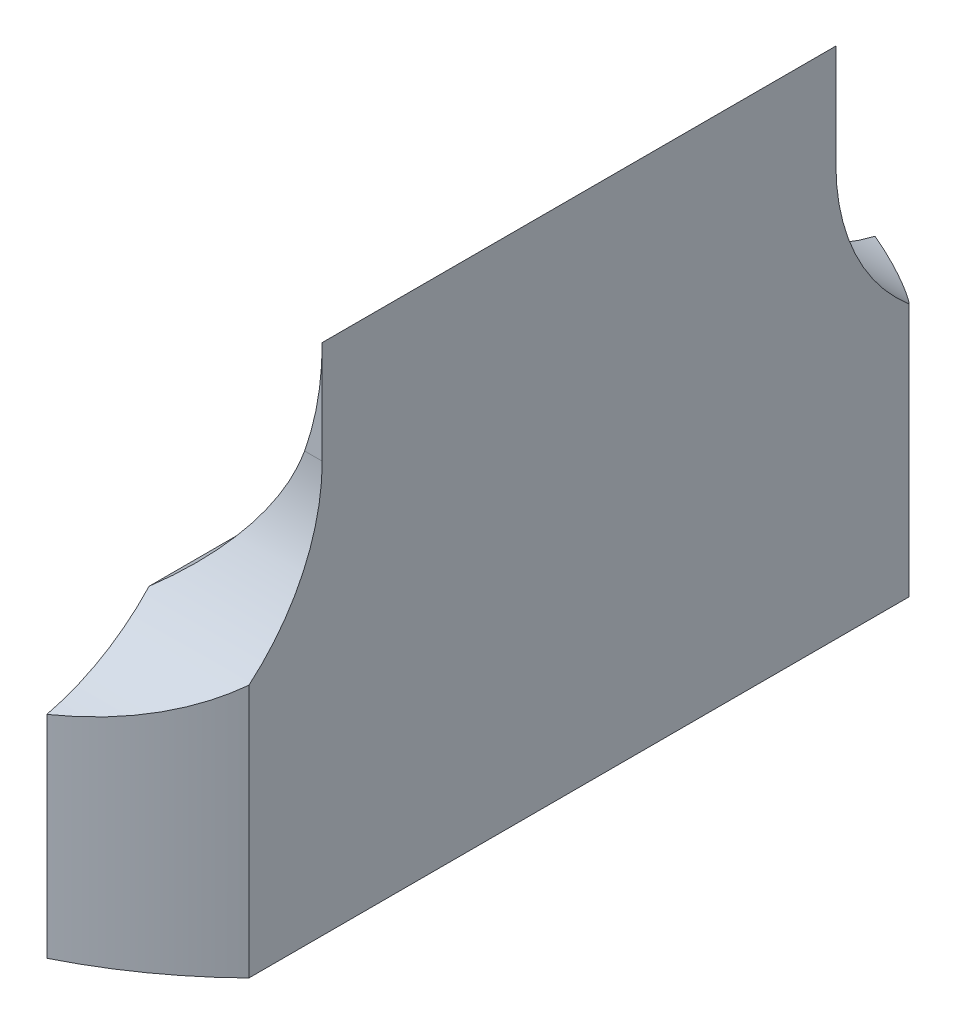
ISO-10303-21;
HEADER;
FILE_DESCRIPTION(('STEP AP214'),'2;1');
FILE_NAME('part.step','',(''),(''),'','','');
FILE_SCHEMA(('AUTOMOTIVE_DESIGN { 1 0 10303 214 1 1 1 1 }'));
ENDSEC;
DATA;
#1=APPLICATION_CONTEXT('core data for automotive mechanical design processes');
#2=APPLICATION_PROTOCOL_DEFINITION('international standard','automotive_design',2000,#1);
#3=PRODUCT_CONTEXT('',#1,'mechanical');
#4=PRODUCT('Part','Part','',(#3));
#5=PRODUCT_RELATED_PRODUCT_CATEGORY('part','',(#4));
#6=PRODUCT_DEFINITION_FORMATION('','',#4);
#7=PRODUCT_DEFINITION_CONTEXT('part definition',#1,'design');
#8=PRODUCT_DEFINITION('design','',#6,#7);
#9=PRODUCT_DEFINITION_SHAPE('','',#8);
#10=(LENGTH_UNIT() NAMED_UNIT(*) SI_UNIT(.MILLI.,.METRE.));
#11=(NAMED_UNIT(*) PLANE_ANGLE_UNIT() SI_UNIT($,.RADIAN.));
#12=(NAMED_UNIT(*) SI_UNIT($,.STERADIAN.) SOLID_ANGLE_UNIT());
#13=UNCERTAINTY_MEASURE_WITH_UNIT(LENGTH_MEASURE(1.E-05),#10,'distance_accuracy_value','');
#14=(GEOMETRIC_REPRESENTATION_CONTEXT(3) GLOBAL_UNCERTAINTY_ASSIGNED_CONTEXT((#13)) GLOBAL_UNIT_ASSIGNED_CONTEXT((#10,
#11,#12)) REPRESENTATION_CONTEXT('',''));
#15=CARTESIAN_POINT('',(0.,0.,0.));
#16=DIRECTION('',(0.,0.,1.));
#17=DIRECTION('',(1.,0.,0.));
#18=AXIS2_PLACEMENT_3D('',#15,#16,#17);
#19=CARTESIAN_POINT('',(0.,0.,0.));
#20=DIRECTION('',(0.,1.,0.));
#21=DIRECTION('',(1.,0.,0.));
#22=AXIS2_PLACEMENT_3D('',#19,#20,#21);
#23=CYLINDRICAL_SURFACE('',#22,28.575);
#24=CARTESIAN_POINT('',(0.,0.,0.));
#25=DIRECTION('',(0.,1.,0.));
#26=DIRECTION('',(1.,0.,0.));
#27=AXIS2_PLACEMENT_3D('',#24,#25,#26);
#28=CIRCLE('',#27,28.575);
#29=CARTESIAN_POINT('',(20.0025,0.,-20.4066317345612));
#30=VERTEX_POINT('',#29);
#31=CARTESIAN_POINT('',(12.7,0.,-25.5976683508479));
#32=VERTEX_POINT('',#31);
#33=EDGE_CURVE('E306',#30,#32,#28,.T.);
#34=ORIENTED_EDGE('',*,*,#33,.T.);
#35=DIRECTION('',(0.,1.,0.));
#36=VECTOR('',#35,1.);
#37=CARTESIAN_POINT('',(12.7,0.,-25.5976683508479));
#38=LINE('',#37,#36);
#39=CARTESIAN_POINT('',(12.7,13.0539279019213,-25.5976683508479));
#40=VERTEX_POINT('',#39);
#41=EDGE_CURVE('E336',#32,#40,#38,.T.);
#42=ORIENTED_EDGE('',*,*,#41,.T.);
#43=CARTESIAN_POINT('',(0.962642902416936,12.7000103571768,-28.5587804999168));
#44=CARTESIAN_POINT('',(1.36077615031565,12.7000623405133,-28.545365693838));
#45=CARTESIAN_POINT('',(1.75862825689667,12.7000777129765,-28.5236151588989));
#46=CARTESIAN_POINT('',(2.55307899624457,12.7004445435241,-28.4635033904875));
#47=CARTESIAN_POINT('',(2.94967761793325,12.7007960045706,-28.4251420106213));
#48=CARTESIAN_POINT('',(3.74118366922109,12.7022448100237,-28.3318388404815));
#49=CARTESIAN_POINT('',(4.13608981320989,12.7033426454376,-28.2768861487437));
#50=CARTESIAN_POINT('',(4.92324947448467,12.7069381444454,-28.1505085427578));
#51=CARTESIAN_POINT('',(5.31550300582789,12.7094358006152,-28.0790837158725));
#52=CARTESIAN_POINT('',(6.09971504117371,12.7166858056302,-27.9192672118512));
#53=CARTESIAN_POINT('',(6.49164726348036,12.7214556290705,-27.8307472529637));
#54=CARTESIAN_POINT('',(7.27137941731256,12.7342954372856,-27.6372759368325));
#55=CARTESIAN_POINT('',(7.65917937419231,12.7423654017998,-27.5323246804678));
#56=CARTESIAN_POINT('',(8.42975640726492,12.7630247664457,-27.3062442784199));
#57=CARTESIAN_POINT('',(8.812535403216,12.7756123837616,-27.1851215263703));
#58=CARTESIAN_POINT('',(9.57240196748498,12.8067151018847,-26.9269527073114));
#59=CARTESIAN_POINT('',(9.94948990980164,12.8252298113896,-26.7899076918588));
#60=CARTESIAN_POINT('',(10.8728927575956,12.8802289715004,-26.4321390525976));
#61=CARTESIAN_POINT('',(11.4154826552702,12.9210691871274,-26.2023507001268));
#62=CARTESIAN_POINT('',(12.4837500266805,13.0247001334094,-25.7105492113056));
#63=CARTESIAN_POINT('',(13.0094275044118,13.0874908588784,-25.4485360825686));
#64=CARTESIAN_POINT('',(14.0386470858148,13.2413188734462,-24.8955218171325));
#65=CARTESIAN_POINT('',(14.5422624206026,13.3322531031995,-24.6046290332762));
#66=CARTESIAN_POINT('',(15.5253033019172,13.5496409172664,-23.9964408297565));
#67=CARTESIAN_POINT('',(16.00473774698,13.6760813211813,-23.6791552381808));
#68=CARTESIAN_POINT('',(16.8002547898732,13.929279583978,-23.1180863962697));
#69=CARTESIAN_POINT('',(17.1234791710534,14.0453697562309,-22.8795842100204));
#70=CARTESIAN_POINT('',(17.7534814131775,14.3020869366,-22.3942506229836));
#71=CARTESIAN_POINT('',(18.0602635161153,14.4427075758031,-22.1474213975529));
#72=CARTESIAN_POINT('',(18.6552298763283,14.7509891906541,-21.6486405827816));
#73=CARTESIAN_POINT('',(18.9434257661075,14.918633018846,-21.3966923297231));
#74=CARTESIAN_POINT('',(19.4993082019271,15.2832535267728,-20.8913521403136));
#75=CARTESIAN_POINT('',(19.7669984548326,15.4802248858411,-20.637960473833));
#76=CARTESIAN_POINT('',(20.2341271799045,15.8672649269116,-20.1791498359493));
#77=CARTESIAN_POINT('',(20.4372307457066,16.0523162460672,-19.9732236603793));
#78=CARTESIAN_POINT('',(20.8271119032842,16.443796771241,-19.566332808773));
#79=CARTESIAN_POINT('',(21.0138928922247,16.6502215092449,-19.3653671066071));
#80=CARTESIAN_POINT('',(21.3701713388706,17.0844581862898,-18.9714767807781));
#81=CARTESIAN_POINT('',(21.5396731298472,17.3122647355465,-18.7785501482909));
#82=CARTESIAN_POINT('',(21.8606787693203,17.7888329761935,-18.4038644456906));
#83=CARTESIAN_POINT('',(22.0121823832151,18.0375949406601,-18.2221055211605));
#84=CARTESIAN_POINT('',(22.297438272533,18.5565357054162,-17.8719385766029));
#85=CARTESIAN_POINT('',(22.43108358143,18.8268293204708,-17.7036132443653));
#86=CARTESIAN_POINT('',(22.6792372793659,19.3860036069198,-17.3845820904179));
#87=CARTESIAN_POINT('',(22.7937450745925,19.6748848546794,-17.2338768154791));
#88=CARTESIAN_POINT('',(23.0034597025063,20.269136197845,-16.9529413254649));
#89=CARTESIAN_POINT('',(23.0986674148259,20.574505540976,-16.822710177309));
#90=CARTESIAN_POINT('',(23.2697906025738,21.1992400080802,-16.5852020755217));
#91=CARTESIAN_POINT('',(23.3457083796063,21.518603456992,-16.4779223836487));
#92=CARTESIAN_POINT('',(23.4701116509596,22.1280288861558,-16.3001450750981));
#93=CARTESIAN_POINT('',(23.5208356823792,22.4167889071979,-16.2267309964662));
#94=CARTESIAN_POINT('',(23.6076984467501,23.0008228741884,-16.1000964209253));
#95=CARTESIAN_POINT('',(23.6438389597366,23.2960960205151,-16.0468734595763));
#96=CARTESIAN_POINT('',(23.7016972571996,23.8916759999176,-15.9612926924391));
#97=CARTESIAN_POINT('',(23.7233869802776,24.1919914724441,-15.9289754861961));
#98=CARTESIAN_POINT('',(23.7450719580057,24.6440955559499,-15.8966136680499));
#99=CARTESIAN_POINT('',(23.7504920138014,24.795104240061,-15.8885120518663));
#100=CARTESIAN_POINT('',(23.7577175691597,25.0974022819727,-15.8777046291041));
#101=CARTESIAN_POINT('',(23.7595230358034,25.2486916423168,-15.874998871667));
#102=CARTESIAN_POINT('',(23.7595244060145,25.39999999873,-15.875));
#103=B_SPLINE_CURVE_WITH_KNOTS('',3,(#43,#44,#45,#46,#47,#48,#49,#50,#51,#52,#53,#54,#55,#56,
#57,#58,#59,#60,#61,#62,#63,#64,#65,#66,#67,#68,#69,#70,#71,#72,#73,#74,#75,#76,#77,#78,#79,#80,
#81,#82,#83,#84,#85,#86,#87,#88,#89,#90,#91,#92,#93,#94,#95,#96,#97,#98,#99,#100,#101,#102),
.UNSPECIFIED.,.F.,.F.,(4,2,2,2,2,2,2,2,2,2,2,2,2,2,2,2,2,2,2,2,2,2,2,2,2,2,2,2,2,4),(0.,
1.19499017100449,2.38999087385894,3.58577847732212,4.78155973885813,5.98668965465626,
7.19181217191521,8.3964596298037,9.60102757414392,11.3715014481902,13.1419749039502,
14.9060402358483,16.6694515852073,17.9228644913696,19.1759524534986,20.4282483813539,
21.6803173910788,22.7094151795703,23.738298272616,24.7669227046618,25.7955605430864,
26.8301070987827,27.8646857491597,28.8992172363417,29.9336252290081,30.8392539837282,
31.7447721657534,32.6520436509738,33.1058917453607,33.559743973042),.UNSPECIFIED.);
#104=CARTESIAN_POINT('',(20.0025,15.6754043847483,-20.4066317345612));
#105=VERTEX_POINT('',#104);
#106=EDGE_CURVE('E54',#40,#105,#103,.T.);
#107=ORIENTED_EDGE('',*,*,#106,.T.);
#108=DIRECTION('',(0.,1.,0.));
#109=VECTOR('',#108,1.);
#110=CARTESIAN_POINT('',(20.0025,0.,-20.4066317345612));
#111=LINE('',#110,#109);
#112=EDGE_CURVE('E334',#105,#30,#111,.F.);
#113=ORIENTED_EDGE('',*,*,#112,.T.);
#114=EDGE_LOOP('',(#34,#42,#107,#113));
#115=FACE_BOUND('',#114,.T.);
#116=ADVANCED_FACE('F49',(#115),#23,.T.);
#117=CARTESIAN_POINT('',(0.962642902407336,12.7000103571768,28.5587804999171));
#118=CARTESIAN_POINT('',(1.36077615030607,12.7000623405133,28.5453656938385));
#119=CARTESIAN_POINT('',(1.75862825688711,12.7000777129765,28.5236151588994));
#120=CARTESIAN_POINT('',(2.55307899623505,12.7004445435241,28.4635033904883));
#121=CARTESIAN_POINT('',(2.94967761792375,12.7007960045706,28.4251420106223));
#122=CARTESIAN_POINT('',(3.74118366921165,12.7022448100237,28.3318388404827));
#123=CARTESIAN_POINT('',(4.13608981320048,12.7033426454376,28.2768861487451));
#124=CARTESIAN_POINT('',(4.92324947447532,12.7069381444453,28.1505085427594));
#125=CARTESIAN_POINT('',(5.31550300581858,12.7094358006151,28.0790837158743));
#126=CARTESIAN_POINT('',(6.09971504116446,12.7166858056301,27.9192672118532));
#127=CARTESIAN_POINT('',(6.49164726347116,12.7214556290704,27.8307472529658));
#128=CARTESIAN_POINT('',(7.27137941730344,12.7342954372854,27.6372759368349));
#129=CARTESIAN_POINT('',(7.65917937418324,12.7423654017996,27.5323246804704));
#130=CARTESIAN_POINT('',(8.42975640725595,12.7630247664454,27.3062442784227));
#131=CARTESIAN_POINT('',(8.81253540320708,12.7756123837612,27.1851215263732));
#132=CARTESIAN_POINT('',(9.57240196747617,12.8067151018843,26.9269527073146));
#133=CARTESIAN_POINT('',(9.94948990979289,12.8252298113892,26.789907691862));
#134=CARTESIAN_POINT('',(10.8728927575873,12.8802289714998,26.4321390526011));
#135=CARTESIAN_POINT('',(11.4154826552622,12.9210691871268,26.2023507001303));
#136=CARTESIAN_POINT('',(12.4837500266732,13.0247001334086,25.7105492113091));
#137=CARTESIAN_POINT('',(13.0094275044049,13.0874908588775,25.4485360825722));
#138=CARTESIAN_POINT('',(14.0386470858086,13.2413188734451,24.895521817136));
#139=CARTESIAN_POINT('',(14.5422624205967,13.3322531031984,24.6046290332797));
#140=CARTESIAN_POINT('',(15.525303301912,13.5496409172651,23.9964408297599));
#141=CARTESIAN_POINT('',(16.0047377469751,13.6760813211799,23.6791552381842));
#142=CARTESIAN_POINT('',(16.8002547898687,13.9292795839765,23.1180863962729));
#143=CARTESIAN_POINT('',(17.1234791710491,14.0453697562292,22.8795842100236));
#144=CARTESIAN_POINT('',(17.7534814131735,14.3020869365982,22.3942506229869));
#145=CARTESIAN_POINT('',(18.0602635161113,14.4427075758013,22.1474213975561));
#146=CARTESIAN_POINT('',(18.6552298763247,14.750989190652,21.6486405827847));
#147=CARTESIAN_POINT('',(18.943425766104,14.9186330188439,21.3966923297261));
#148=CARTESIAN_POINT('',(19.499308201924,15.2832535267705,20.8913521403166));
#149=CARTESIAN_POINT('',(19.7669984548296,15.4802248858388,20.6379604738359));
#150=CARTESIAN_POINT('',(20.2341271799018,15.8672649269092,20.1791498359521));
#151=CARTESIAN_POINT('',(20.437230745704,16.0523162460648,19.973223660382));
#152=CARTESIAN_POINT('',(20.8271119032818,16.4437967712384,19.5663328087756));
#153=CARTESIAN_POINT('',(21.0138928922225,16.6502215092423,19.3653671066095));
#154=CARTESIAN_POINT('',(21.3701713388686,17.0844581862872,18.9714767807804));
#155=CARTESIAN_POINT('',(21.5396731298453,17.3122647355437,18.7785501482932));
#156=CARTESIAN_POINT('',(21.8606787693184,17.7888329761907,18.4038644456928));
#157=CARTESIAN_POINT('',(22.0121823832134,18.0375949406571,18.2221055211626));
#158=CARTESIAN_POINT('',(22.2974382725314,18.556535705413,17.8719385766049));
#159=CARTESIAN_POINT('',(22.4310835814285,18.8268293204675,17.7036132443673));
#160=CARTESIAN_POINT('',(22.6792372793645,19.3860036069163,17.3845820904198));
#161=CARTESIAN_POINT('',(22.7937450745911,19.6748848546757,17.233876815481));
#162=CARTESIAN_POINT('',(23.0034597025051,20.2691361978413,16.9529413254666));
#163=CARTESIAN_POINT('',(23.0986674148248,20.5745055409723,16.8227101773105));
#164=CARTESIAN_POINT('',(23.269790602573,21.1992400080767,16.5852020755229));
#165=CARTESIAN_POINT('',(23.3457083796055,21.5186034569886,16.4779223836498));
#166=CARTESIAN_POINT('',(23.4701116509792,22.1280288862518,16.3001450750701));
#167=CARTESIAN_POINT('',(23.520835682414,22.4167889073961,16.2267309964158));
#168=CARTESIAN_POINT('',(23.6076984468052,23.000822874595,16.1000964208445));
#169=CARTESIAN_POINT('',(23.6438389597967,23.2960960210277,16.0468734594876));
#170=CARTESIAN_POINT('',(23.7016972572599,23.8916760006455,15.9612926923495));
#171=CARTESIAN_POINT('',(23.723386980333,24.1919914732812,15.9289754861136));
#172=CARTESIAN_POINT('',(23.7450719580461,24.6440955569502,15.8966136679896));
#173=CARTESIAN_POINT('',(23.7504920138354,24.7951042411157,15.8885120518154));
#174=CARTESIAN_POINT('',(23.7577175691787,25.0974022831355,15.8777046290757));
#175=CARTESIAN_POINT('',(23.7595230358135,25.2486916435334,15.8749988716518));
#176=CARTESIAN_POINT('',(23.7595244060145,25.4,15.875));
#177=B_SPLINE_CURVE_WITH_KNOTS('',3,(#117,#118,#119,#120,#121,#122,#123,#124,#125,#126,#127,
#128,#129,#130,#131,#132,#133,#134,#135,#136,#137,#138,#139,#140,#141,#142,#143,#144,#145,#146,
#147,#148,#149,#150,#151,#152,#153,#154,#155,#156,#157,#158,#159,#160,#161,#162,#163,#164,#165,
#166,#167,#168,#169,#170,#171,#172,#173,#174,#175,#176),.UNSPECIFIED.,.F.,.F.,(4,2,2,2,2,2,2,2,
2,2,2,2,2,2,2,2,2,2,2,2,2,2,2,2,2,2,2,2,2,4),(0.,1.19499017100453,2.38999087385901,
3.58577847732223,4.78155973885826,5.98668965465643,7.19181217191541,8.39645962980394,
9.60102757414419,11.3715014481914,13.1419749039523,14.9060402358512,16.6694515852111,
17.9228644913736,19.1759524535028,20.4282483813585,21.6803173910837,22.7094151795755,
23.7382982726215,24.7669227046673,25.795560543092,26.8301070987882,27.8646857491649,
28.8992172363473,29.9336252290144,30.8392539840501,31.7447721663913,32.652043651932,
33.1058917464792,33.5597439743207),.UNSPECIFIED.);
#178=CARTESIAN_POINT('',(12.7,13.0539279019213,25.5976683508479));
#179=VERTEX_POINT('',#178);
#180=CARTESIAN_POINT('',(20.0025,15.6754043847483,20.4066317345612));
#181=VERTEX_POINT('',#180);
#182=EDGE_CURVE('E364',#179,#181,#177,.T.);
#183=ORIENTED_EDGE('',*,*,#182,.F.);
#184=DIRECTION('',(0.,1.,0.));
#185=VECTOR('',#184,1.);
#186=CARTESIAN_POINT('',(12.7,0.,25.5976683508479));
#187=LINE('',#186,#185);
#188=CARTESIAN_POINT('',(12.7,0.,25.5976683508479));
#189=VERTEX_POINT('',#188);
#190=EDGE_CURVE('E130',#179,#189,#187,.F.);
#191=ORIENTED_EDGE('',*,*,#190,.T.);
#192=CARTESIAN_POINT('',(20.0025,0.,20.4066317345612));
#193=VERTEX_POINT('',#192);
#194=EDGE_CURVE('E302',#189,#193,#28,.T.);
#195=ORIENTED_EDGE('',*,*,#194,.T.);
#196=DIRECTION('',(0.,1.,0.));
#197=VECTOR('',#196,1.);
#198=CARTESIAN_POINT('',(20.0025,0.,20.4066317345612));
#199=LINE('',#198,#197);
#200=EDGE_CURVE('E344',#193,#181,#199,.T.);
#201=ORIENTED_EDGE('',*,*,#200,.T.);
#202=EDGE_LOOP('',(#183,#191,#195,#201));
#203=FACE_BOUND('',#202,.T.);
#204=ADVANCED_FACE('F193',(#203),#23,.T.);
#205=CARTESIAN_POINT('',(-31.75,25.4,-28.575));
#206=DIRECTION('',(-1.,0.,0.));
#207=DIRECTION('',(0.,0.,1.));
#208=AXIS2_PLACEMENT_3D('',#205,#206,#207);
#209=CYLINDRICAL_SURFACE('',#208,12.7);
#210=CARTESIAN_POINT('',(12.7,25.4,-28.575));
#211=DIRECTION('',(-1.,0.,0.));
#212=DIRECTION('',(0.,0.,1.));
#213=AXIS2_PLACEMENT_3D('',#210,#211,#212);
#214=CIRCLE('',#213,12.7);
#215=CARTESIAN_POINT('',(12.6999999387665,16.753534986885,-19.2733269453938));
#216=VERTEX_POINT('',#215);
#217=EDGE_CURVE('E119',#216,#40,#214,.F.);
#218=ORIENTED_EDGE('',*,*,#217,.F.);
#219=CARTESIAN_POINT('',(12.699691218957,16.7537714883731,-19.2727028361415));
#220=CARTESIAN_POINT('',(12.870659380108,16.8878217421531,-19.1481104679235));
#221=CARTESIAN_POINT('',(13.040261868619,17.025509515662,-19.025530904926));
#222=CARTESIAN_POINT('',(13.3724354123003,17.3048490098242,-18.7876925137616));
#223=CARTESIAN_POINT('',(13.5350775906488,17.4463268619352,-18.6723286722611));
#224=CARTESIAN_POINT('',(13.8533338184119,17.732833820106,-18.4489569616947));
#225=CARTESIAN_POINT('',(14.009022643473,17.8776934568953,-18.3408385255124));
#226=CARTESIAN_POINT('',(14.3133666115578,18.1705582446272,-18.1319773793761));
#227=CARTESIAN_POINT('',(14.462100583864,18.3183986392175,-18.0311187129767));
#228=CARTESIAN_POINT('',(14.7525306137605,18.6168268934788,-17.8367749752979));
#229=CARTESIAN_POINT('',(14.8943097119548,18.7672550420969,-17.7431689195456));
#230=CARTESIAN_POINT('',(15.1708277587382,19.0704756216022,-17.5633058651655));
#231=CARTESIAN_POINT('',(15.3056540898434,19.223113577461,-17.4769232818383));
#232=CARTESIAN_POINT('',(15.5218584820229,19.4760776752996,-17.3407055247863));
#233=CARTESIAN_POINT('',(15.6043550642841,19.5746021760686,-17.2892916728169));
#234=CARTESIAN_POINT('',(15.7394566197589,19.7393885642523,-17.2060599636384));
#235=CARTESIAN_POINT('',(15.7925016664671,19.8049836830744,-17.1736323893834));
#236=CARTESIAN_POINT('',(15.9895293067242,20.0520353902443,-17.0541634430485));
#237=CARTESIAN_POINT('',(16.1313356357565,20.2367250884086,-16.9701526616253));
#238=CARTESIAN_POINT('',(16.4072010277424,20.6102036052326,-16.8111421268616));
#239=CARTESIAN_POINT('',(16.5413501309507,20.7988717435486,-16.7360148868162));
#240=CARTESIAN_POINT('',(16.8019024841224,21.1798820289229,-16.5949669504903));
#241=CARTESIAN_POINT('',(16.9283965003368,21.3721137216014,-16.5289158453305));
#242=CARTESIAN_POINT('',(17.173657387159,21.7598159889454,-16.4061980564995));
#243=CARTESIAN_POINT('',(17.2925149811617,21.955186868401,-16.3493991717202));
#244=CARTESIAN_POINT('',(17.444995313502,22.2161488903784,-16.2803955236732));
#245=CARTESIAN_POINT('',(17.4813325111958,22.2791431348277,-16.2642526418283));
#246=CARTESIAN_POINT('',(17.6012111693,22.489579310565,-16.2120535489913));
#247=CARTESIAN_POINT('',(17.683464359556,22.6382539066604,-16.1779713873401));
#248=CARTESIAN_POINT('',(17.8759651606648,22.9976787939529,-16.102447922668));
#249=CARTESIAN_POINT('',(17.9845059224019,23.2098551161892,-16.063380941619));
#250=CARTESIAN_POINT('',(18.15409030348,23.5591758062656,-16.0083826729585));
#251=CARTESIAN_POINT('',(18.2176707188565,23.6945923677559,-15.9892713123295));
#252=CARTESIAN_POINT('',(18.3027651151215,23.8842697456747,-15.9656618018271));
#253=CARTESIAN_POINT('',(18.3261983172084,23.9374505642347,-15.9593813035561));
#254=CARTESIAN_POINT('',(18.3890591807512,24.0825792525985,-15.9431781362732));
#255=CARTESIAN_POINT('',(18.4278555783994,24.1748715226359,-15.933888763252));
#256=CARTESIAN_POINT('',(18.5110667029964,24.3761184828356,-15.9158697907109));
#257=CARTESIAN_POINT('',(18.5552884196543,24.4851860319397,-15.9075169099148));
#258=CARTESIAN_POINT('',(18.6492528535834,24.7200600220357,-15.8925911669144));
#259=CARTESIAN_POINT('',(18.6988443390631,24.8459554043702,-15.8864645445396));
#260=CARTESIAN_POINT('',(18.8034768944556,25.1144861806401,-15.8774090415589));
#261=CARTESIAN_POINT('',(18.8583960215718,25.2571866811672,-15.8749944192713));
#262=CARTESIAN_POINT('',(18.9130122421383,25.4,-15.875));
#263=B_SPLINE_CURVE_WITH_KNOTS('',3,(#219,#220,#221,#222,#223,#224,#225,#226,#227,#228,#229,
#230,#231,#232,#233,#234,#235,#236,#237,#238,#239,#240,#241,#242,#243,#244,#245,#246,#247,#248,
#249,#250,#251,#252,#253,#254,#255,#256,#257,#258,#259,#260,#261,#262),.UNSPECIFIED.,.F.,.F.,(4,
2,2,2,2,2,2,2,2,2,2,2,2,2,2,2,2,2,2,2,2,4),(0.,0.751316815761274,1.48464287005956,
2.20017495652837,2.89812492124998,3.57872102939048,4.24220945828522,4.65738307924192,
4.92850687409446,5.67083082262449,6.40070619515031,7.11865187996518,7.82521304882013,
8.04868791238139,8.56844634501888,9.2925369381365,9.74485703519448,9.92020838154147,
10.2218077830222,10.5757320491921,10.9820234211269,11.4407090768113),.UNSPECIFIED.);
#264=CARTESIAN_POINT('',(18.9130122934536,25.4000001451415,-15.875));
#265=VERTEX_POINT('',#264);
#266=EDGE_CURVE('E125',#216,#265,#263,.T.);
#267=ORIENTED_EDGE('',*,*,#266,.T.);
#268=DIRECTION('',(-1.,0.,0.));
#269=VECTOR('',#268,1.);
#270=CARTESIAN_POINT('',(-31.75,25.4,-15.875));
#271=LINE('',#270,#269);
#272=CARTESIAN_POINT('',(20.0025,25.4,-15.875));
#273=VERTEX_POINT('',#272);
#274=EDGE_CURVE('E323',#265,#273,#271,.F.);
#275=ORIENTED_EDGE('',*,*,#274,.T.);
#276=CARTESIAN_POINT('',(20.0025,25.4,-28.575));
#277=DIRECTION('',(1.,0.,0.));
#278=DIRECTION('',(0.,0.,-1.));
#279=AXIS2_PLACEMENT_3D('',#276,#277,#278);
#280=CIRCLE('',#279,12.7);
#281=EDGE_CURVE('E339',#105,#273,#280,.F.);
#282=ORIENTED_EDGE('',*,*,#281,.F.);
#283=ORIENTED_EDGE('',*,*,#106,.F.);
#284=EDGE_LOOP('',(#218,#267,#275,#282,#283));
#285=FACE_BOUND('',#284,.T.);
#286=ADVANCED_FACE('F51',(#285),#209,.F.);
#287=CARTESIAN_POINT('',(-31.75,25.4,28.575));
#288=DIRECTION('',(1.,0.,0.));
#289=DIRECTION('',(0.,0.,-1.));
#290=AXIS2_PLACEMENT_3D('',#287,#288,#289);
#291=CYLINDRICAL_SURFACE('',#290,12.7);
#292=CARTESIAN_POINT('',(12.7,25.4,28.575));
#293=DIRECTION('',(-1.,0.,0.));
#294=DIRECTION('',(0.,0.,1.));
#295=AXIS2_PLACEMENT_3D('',#292,#293,#294);
#296=CIRCLE('',#295,12.7);
#297=CARTESIAN_POINT('',(12.6999999346512,16.7535350695487,19.2733433640383));
#298=VERTEX_POINT('',#297);
#299=EDGE_CURVE('E68',#179,#298,#296,.F.);
#300=ORIENTED_EDGE('',*,*,#299,.F.);
#301=ORIENTED_EDGE('',*,*,#182,.T.);
#302=CARTESIAN_POINT('',(20.0025,25.4,28.575));
#303=DIRECTION('',(1.,0.,0.));
#304=DIRECTION('',(0.,0.,-1.));
#305=AXIS2_PLACEMENT_3D('',#302,#303,#304);
#306=CIRCLE('',#305,12.7);
#307=CARTESIAN_POINT('',(20.0025,25.4,15.875));
#308=VERTEX_POINT('',#307);
#309=EDGE_CURVE('E347',#308,#181,#306,.F.);
#310=ORIENTED_EDGE('',*,*,#309,.F.);
#311=DIRECTION('',(1.,0.,0.));
#312=VECTOR('',#311,1.);
#313=CARTESIAN_POINT('',(-31.75,25.4,15.875));
#314=LINE('',#313,#312);
#315=CARTESIAN_POINT('',(18.9130097453465,25.3999929380489,15.8750002500005));
#316=VERTEX_POINT('',#315);
#317=EDGE_CURVE('E61',#316,#308,#314,.T.);
#318=ORIENTED_EDGE('',*,*,#317,.F.);
#319=CARTESIAN_POINT('',(12.7003125989401,16.7536204655862,19.2734043980917));
#320=CARTESIAN_POINT('',(12.8715447439971,16.8877610505532,19.1488547761871));
#321=CARTESIAN_POINT('',(13.0413917106182,17.0255465526106,19.0262995631861));
#322=CARTESIAN_POINT('',(13.3738825272611,17.3050090673515,18.7885286185845));
#323=CARTESIAN_POINT('',(13.5366008093133,17.4465071516251,18.6732065240072));
#324=CARTESIAN_POINT('',(13.8548516682685,17.7329919846216,18.449897093252));
#325=CARTESIAN_POINT('',(14.0104623762534,17.8778052331785,18.341798789792));
#326=CARTESIAN_POINT('',(14.3145294554301,18.1705270561998,18.1329442856415));
#327=CARTESIAN_POINT('',(14.4630674429097,18.3182679808959,18.0320721391876));
#328=CARTESIAN_POINT('',(14.7530377144595,18.6164621529521,17.8376743764295));
#329=CARTESIAN_POINT('',(14.8945547645225,18.7667540495572,17.7440278691879));
#330=CARTESIAN_POINT('',(15.1705520088524,19.0696839606712,17.564086273985));
#331=CARTESIAN_POINT('',(15.3051196613654,19.2221672562037,17.4776653583362));
#332=CARTESIAN_POINT('',(15.5213511301833,19.4753270953825,17.3411760657077));
#333=CARTESIAN_POINT('',(15.6041080169148,19.5742200178423,17.289523191534));
#334=CARTESIAN_POINT('',(15.7391686856761,19.7390077628524,17.2062702328107));
#335=CARTESIAN_POINT('',(15.7919074840823,19.8042244433536,17.1740294971742));
#336=CARTESIAN_POINT('',(15.9889182794246,20.0511806070662,17.0546377565225));
#337=CARTESIAN_POINT('',(16.1310704976083,20.2361597933021,16.9706230161228));
#338=CARTESIAN_POINT('',(16.40746730509,20.6100021363947,16.8117692719851));
#339=CARTESIAN_POINT('',(16.5418080890714,20.7987357702435,16.7367925136421));
#340=CARTESIAN_POINT('',(16.8025544941741,21.1797285872535,16.5960145795891));
#341=CARTESIAN_POINT('',(16.9290568280727,21.3718713825639,16.5300778219897));
#342=CARTESIAN_POINT('',(17.1741135855966,21.7593329602878,16.4073607890907));
#343=CARTESIAN_POINT('',(17.2927639715563,21.9545488698546,16.3504487419113));
#344=CARTESIAN_POINT('',(17.4450231572474,22.2156151690684,16.2809924669597));
#345=CARTESIAN_POINT('',(17.4814251175994,22.2788610451082,16.2646683668832));
#346=CARTESIAN_POINT('',(17.6013605780114,22.490044661036,16.2117869348624));
#347=CARTESIAN_POINT('',(17.683486046027,22.6392485680082,16.1770558257253));
#348=CARTESIAN_POINT('',(17.8754214496763,22.9993707649748,16.1002667029426));
#349=CARTESIAN_POINT('',(17.9835650070321,23.2117057597522,16.0606185987525));
#350=CARTESIAN_POINT('',(18.1530256843647,23.5605824427244,16.0059688611978));
#351=CARTESIAN_POINT('',(18.2165997749441,23.695455498118,15.9873146372106));
#352=CARTESIAN_POINT('',(18.3029441132808,23.8843794114314,15.9657979967937));
#353=CARTESIAN_POINT('',(18.3269545171277,23.9375586002003,15.9602427284691));
#354=CARTESIAN_POINT('',(18.3916224409164,24.0825634538511,15.9463582513245));
#355=CARTESIAN_POINT('',(18.4318313014002,24.1746727465101,15.9389080383758));
#356=CARTESIAN_POINT('',(18.5175770213535,24.375419479599,15.9242946343951));
#357=CARTESIAN_POINT('',(18.5628484885723,24.4841885627341,15.9173986223693));
#358=CARTESIAN_POINT('',(18.6578671045672,24.7185904262621,15.9040254834592));
#359=CARTESIAN_POINT('',(18.707300095843,24.8443623514391,15.8977572321466));
#360=CARTESIAN_POINT('',(18.8096414434723,25.113114975676,15.8857391451144));
#361=CARTESIAN_POINT('',(18.8621870945992,25.2562415981628,15.8801578198654));
#362=CARTESIAN_POINT('',(18.9130072490266,25.3999858773651,15.8750005000009));
#363=B_SPLINE_CURVE_WITH_KNOTS('',3,(#319,#320,#321,#322,#323,#324,#325,#326,#327,#328,#329,
#330,#331,#332,#333,#334,#335,#336,#337,#338,#339,#340,#341,#342,#343,#344,#345,#346,#347,#348,
#349,#350,#351,#352,#353,#354,#355,#356,#357,#358,#359,#360,#361,#362),.UNSPECIFIED.,.F.,.F.,(4,
2,2,2,2,2,2,2,2,2,2,2,2,2,2,2,2,2,2,2,2,4),(0.,0.751938824970576,1.48539299627619,
2.20066069405109,2.89806342811596,3.57794805518762,4.24068893977385,4.65738047924094,
4.9269400444814,5.67050733291985,6.40071311181146,7.11836566132472,7.82431638181626,
8.04864276572548,8.56997012205541,9.2942136647027,9.74487079433476,9.92069736020953,
10.2229972270456,10.5770166584689,10.9828280534503,11.4404789110165),.UNSPECIFIED.);
#364=EDGE_CURVE('E76',#298,#316,#363,.T.);
#365=ORIENTED_EDGE('',*,*,#364,.F.);
#366=EDGE_LOOP('',(#300,#301,#310,#318,#365));
#367=FACE_BOUND('',#366,.T.);
#368=ADVANCED_FACE('F163',(#367),#291,.F.);
#369=CARTESIAN_POINT('',(0.,0.,0.));
#370=DIRECTION('',(0.,1.,0.));
#371=DIRECTION('',(1.,0.,0.));
#372=AXIS2_PLACEMENT_3D('',#369,#370,#371);
#373=PLANE('',#372);
#374=DIRECTION('',(0.,0.,1.));
#375=VECTOR('',#374,1.);
#376=CARTESIAN_POINT('',(12.7,0.,0.));
#377=LINE('',#376,#375);
#378=EDGE_CURVE('E474',#32,#189,#377,.T.);
#379=ORIENTED_EDGE('',*,*,#378,.F.);
#380=ORIENTED_EDGE('',*,*,#33,.F.);
#381=DIRECTION('',(0.,0.,-1.));
#382=VECTOR('',#381,1.);
#383=CARTESIAN_POINT('',(20.0025,0.,0.));
#384=LINE('',#383,#382);
#385=EDGE_CURVE('E139',#193,#30,#384,.T.);
#386=ORIENTED_EDGE('',*,*,#385,.F.);
#387=ORIENTED_EDGE('',*,*,#194,.F.);
#388=EDGE_LOOP('',(#379,#380,#386,#387));
#389=FACE_BOUND('',#388,.T.);
#390=ADVANCED_FACE('F162',(#389),#373,.F.);
#391=CARTESIAN_POINT('',(0.9525,31.75,103.07574));
#392=DIRECTION('',(0.,0.,-1.));
#393=DIRECTION('',(1.,0.,0.));
#394=AXIS2_PLACEMENT_3D('',#391,#392,#393);
#395=CYLINDRICAL_SURFACE('',#394,19.05);
#396=DIRECTION('',(0.,0.,-1.));
#397=VECTOR('',#396,1.);
#398=CARTESIAN_POINT('',(12.7,16.7533755881532,103.07574));
#399=LINE('',#398,#397);
#400=EDGE_CURVE('E13',#298,#216,#399,.T.);
#401=ORIENTED_EDGE('',*,*,#400,.F.);
#402=ORIENTED_EDGE('',*,*,#364,.T.);
#403=CARTESIAN_POINT('',(0.9525,31.75,15.875));
#404=DIRECTION('',(0.,0.,-1.));
#405=DIRECTION('',(-1.,0.,0.));
#406=AXIS2_PLACEMENT_3D('',#403,#404,#405);
#407=CIRCLE('',#406,19.05);
#408=CARTESIAN_POINT('',(20.0025,31.75,15.875));
#409=VERTEX_POINT('',#408);
#410=EDGE_CURVE('E311',#409,#316,#407,.T.);
#411=ORIENTED_EDGE('',*,*,#410,.F.);
#412=DIRECTION('',(0.,0.,-1.));
#413=VECTOR('',#412,1.);
#414=CARTESIAN_POINT('',(20.0025,31.75,103.07574));
#415=LINE('',#414,#413);
#416=CARTESIAN_POINT('',(20.0025,31.75,-15.875));
#417=VERTEX_POINT('',#416);
#418=EDGE_CURVE('E316',#409,#417,#415,.T.);
#419=ORIENTED_EDGE('',*,*,#418,.T.);
#420=CARTESIAN_POINT('',(0.9525,31.75,-15.875));
#421=DIRECTION('',(0.,0.,-1.));
#422=DIRECTION('',(-1.,0.,0.));
#423=AXIS2_PLACEMENT_3D('',#420,#421,#422);
#424=CIRCLE('',#423,19.05);
#425=EDGE_CURVE('E137',#417,#265,#424,.T.);
#426=ORIENTED_EDGE('',*,*,#425,.T.);
#427=ORIENTED_EDGE('',*,*,#266,.F.);
#428=EDGE_LOOP('',(#401,#402,#411,#419,#426,#427));
#429=FACE_BOUND('',#428,.T.);
#430=ADVANCED_FACE('F134',(#429),#395,.F.);
#431=CARTESIAN_POINT('',(-31.75,25.4,-15.875));
#432=DIRECTION('',(0.,0.,-1.));
#433=DIRECTION('',(0.,1.,0.));
#434=AXIS2_PLACEMENT_3D('',#431,#432,#433);
#435=PLANE('',#434);
#436=ORIENTED_EDGE('',*,*,#425,.F.);
#437=DIRECTION('',(0.,-1.,0.));
#438=VECTOR('',#437,1.);
#439=CARTESIAN_POINT('',(20.0025,25.4,-15.875));
#440=LINE('',#439,#438);
#441=EDGE_CURVE('E354',#417,#273,#440,.T.);
#442=ORIENTED_EDGE('',*,*,#441,.T.);
#443=ORIENTED_EDGE('',*,*,#274,.F.);
#444=EDGE_LOOP('',(#436,#442,#443));
#445=FACE_BOUND('',#444,.T.);
#446=ADVANCED_FACE('F161',(#445),#435,.T.);
#447=CARTESIAN_POINT('',(-31.75,25.4,15.875));
#448=DIRECTION('',(0.,0.,-1.));
#449=DIRECTION('',(0.,1.,0.));
#450=AXIS2_PLACEMENT_3D('',#447,#448,#449);
#451=PLANE('',#450);
#452=DIRECTION('',(0.,-1.,0.));
#453=VECTOR('',#452,1.);
#454=CARTESIAN_POINT('',(20.0025,25.4,15.875));
#455=LINE('',#454,#453);
#456=EDGE_CURVE('E470',#409,#308,#455,.T.);
#457=ORIENTED_EDGE('',*,*,#456,.F.);
#458=ORIENTED_EDGE('',*,*,#410,.T.);
#459=ORIENTED_EDGE('',*,*,#317,.T.);
#460=EDGE_LOOP('',(#457,#458,#459));
#461=FACE_BOUND('',#460,.T.);
#462=ADVANCED_FACE('F169',(#461),#451,.F.);
#463=CARTESIAN_POINT('',(20.0025,0.,0.));
#464=DIRECTION('',(1.,0.,0.));
#465=DIRECTION('',(0.,0.,-1.));
#466=AXIS2_PLACEMENT_3D('',#463,#464,#465);
#467=PLANE('',#466);
#468=ORIENTED_EDGE('',*,*,#385,.T.);
#469=ORIENTED_EDGE('',*,*,#112,.F.);
#470=ORIENTED_EDGE('',*,*,#281,.T.);
#471=ORIENTED_EDGE('',*,*,#441,.F.);
#472=ORIENTED_EDGE('',*,*,#418,.F.);
#473=ORIENTED_EDGE('',*,*,#456,.T.);
#474=ORIENTED_EDGE('',*,*,#309,.T.);
#475=ORIENTED_EDGE('',*,*,#200,.F.);
#476=EDGE_LOOP('',(#468,#469,#470,#471,#472,#473,#474,#475));
#477=FACE_BOUND('',#476,.T.);
#478=ADVANCED_FACE('F338',(#477),#467,.T.);
#479=CARTESIAN_POINT('',(12.7,0.,0.));
#480=DIRECTION('',(-1.,0.,0.));
#481=DIRECTION('',(0.,0.,1.));
#482=AXIS2_PLACEMENT_3D('',#479,#480,#481);
#483=PLANE('',#482);
#484=ORIENTED_EDGE('',*,*,#378,.T.);
#485=ORIENTED_EDGE('',*,*,#190,.F.);
#486=ORIENTED_EDGE('',*,*,#299,.T.);
#487=ORIENTED_EDGE('',*,*,#400,.T.);
#488=ORIENTED_EDGE('',*,*,#217,.T.);
#489=ORIENTED_EDGE('',*,*,#41,.F.);
#490=EDGE_LOOP('',(#484,#485,#486,#487,#488,#489));
#491=FACE_BOUND('',#490,.T.);
#492=ADVANCED_FACE('F118',(#491),#483,.T.);
#493=CLOSED_SHELL('',(#116,#204,#286,#368,#390,#430,#446,#462,#478,#492));
#494=MANIFOLD_SOLID_BREP('B2',#493);
#495=ADVANCED_BREP_SHAPE_REPRESENTATION('',(#18,#494),#14);
#496=SHAPE_DEFINITION_REPRESENTATION(#9,#495);
ENDSEC;
END-ISO-10303-21;
